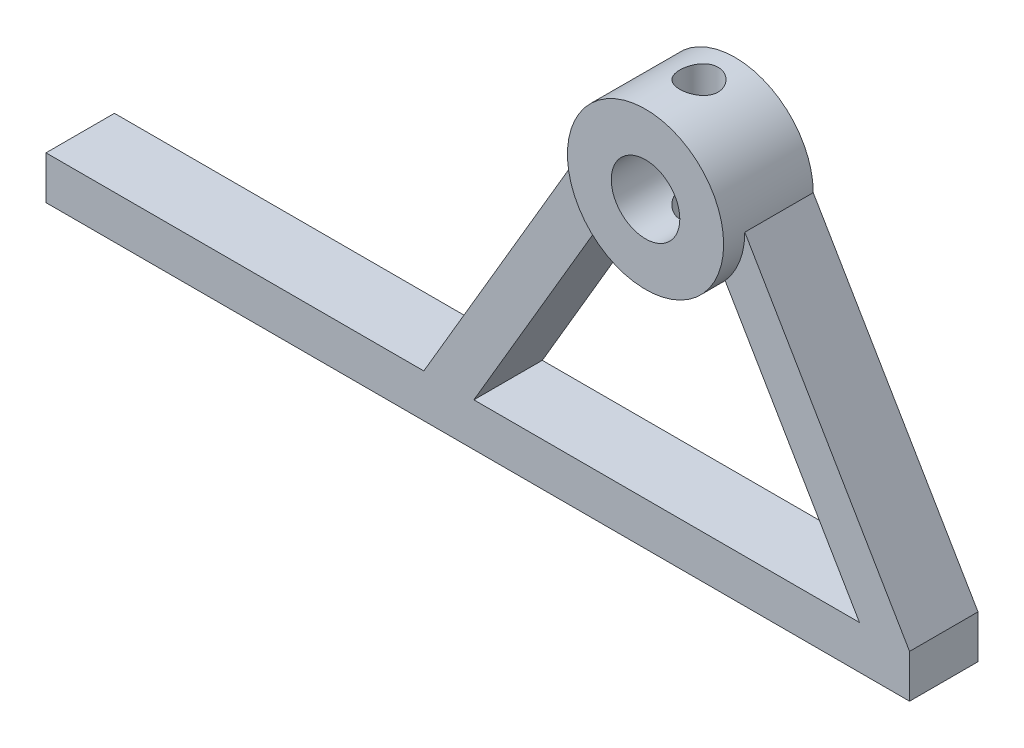
ISO-10303-21;
HEADER;
FILE_DESCRIPTION(('STEP AP214'),'2;1');
FILE_NAME('part.step','',(''),(''),'','','');
FILE_SCHEMA(('AUTOMOTIVE_DESIGN { 1 0 10303 214 1 1 1 1 }'));
ENDSEC;
DATA;
#1=APPLICATION_CONTEXT('core data for automotive mechanical design processes');
#2=APPLICATION_PROTOCOL_DEFINITION('international standard','automotive_design',2000,#1);
#3=PRODUCT_CONTEXT('',#1,'mechanical');
#4=PRODUCT('Part','Part','',(#3));
#5=PRODUCT_RELATED_PRODUCT_CATEGORY('part','',(#4));
#6=PRODUCT_DEFINITION_FORMATION('','',#4);
#7=PRODUCT_DEFINITION_CONTEXT('part definition',#1,'design');
#8=PRODUCT_DEFINITION('design','',#6,#7);
#9=PRODUCT_DEFINITION_SHAPE('','',#8);
#10=(LENGTH_UNIT() NAMED_UNIT(*) SI_UNIT(.MILLI.,.METRE.));
#11=(NAMED_UNIT(*) PLANE_ANGLE_UNIT() SI_UNIT($,.RADIAN.));
#12=(NAMED_UNIT(*) SI_UNIT($,.STERADIAN.) SOLID_ANGLE_UNIT());
#13=UNCERTAINTY_MEASURE_WITH_UNIT(LENGTH_MEASURE(1.E-05),#10,'distance_accuracy_value','');
#14=(GEOMETRIC_REPRESENTATION_CONTEXT(3) GLOBAL_UNCERTAINTY_ASSIGNED_CONTEXT((#13)) GLOBAL_UNIT_ASSIGNED_CONTEXT((#10,
#11,#12)) REPRESENTATION_CONTEXT('',''));
#15=CARTESIAN_POINT('',(0.,0.,0.));
#16=DIRECTION('',(0.,0.,1.));
#17=DIRECTION('',(1.,0.,0.));
#18=AXIS2_PLACEMENT_3D('',#15,#16,#17);
#19=CARTESIAN_POINT('',(0.,8.31996617059704,6.34));
#20=DIRECTION('',(0.,0.,-1.));
#21=DIRECTION('',(-1.,0.,0.));
#22=AXIS2_PLACEMENT_3D('',#19,#20,#21);
#23=CYLINDRICAL_SURFACE('',#22,7.23570529257752);
#24=DIRECTION('',(0.,0.,-1.));
#25=VECTOR('',#24,1.);
#26=CARTESIAN_POINT('',(5.41494743870985,3.52061461887218,6.34));
#27=LINE('',#26,#25);
#28=CARTESIAN_POINT('',(5.41494743870985,3.52061461887218,6.34));
#29=VERTEX_POINT('',#28);
#30=CARTESIAN_POINT('',(5.41494743870985,3.52061461887218,0.));
#31=VERTEX_POINT('',#30);
#32=EDGE_CURVE('E255',#29,#31,#27,.T.);
#33=ORIENTED_EDGE('',*,*,#32,.F.);
#34=CARTESIAN_POINT('',(0.,8.31996617059704,6.34));
#35=DIRECTION('',(0.,0.,1.));
#36=DIRECTION('',(1.,0.,0.));
#37=AXIS2_PLACEMENT_3D('',#34,#35,#36);
#38=CIRCLE('',#37,7.2357052925775);
#39=CARTESIAN_POINT('',(7.2357052925775,8.31996617059704,6.34));
#40=VERTEX_POINT('',#39);
#41=EDGE_CURVE('E110',#29,#40,#38,.T.);
#42=ORIENTED_EDGE('',*,*,#41,.T.);
#43=DIRECTION('',(0.,0.,-1.));
#44=VECTOR('',#43,1.);
#45=CARTESIAN_POINT('',(7.23570529378876,8.31996617059705,6.34));
#46=LINE('',#45,#44);
#47=CARTESIAN_POINT('',(7.23570529378876,8.31996617059705,0.));
#48=VERTEX_POINT('',#47);
#49=EDGE_CURVE('E317',#40,#48,#46,.T.);
#50=ORIENTED_EDGE('',*,*,#49,.T.);
#51=CARTESIAN_POINT('',(0.,8.31996617059704,0.));
#52=DIRECTION('',(0.,0.,1.));
#53=DIRECTION('',(1.,0.,0.));
#54=AXIS2_PLACEMENT_3D('',#51,#52,#53);
#55=CIRCLE('',#54,7.23570529257752);
#56=CARTESIAN_POINT('',(-7.23570529378876,8.31996617059705,0.));
#57=VERTEX_POINT('',#56);
#58=EDGE_CURVE('E342',#48,#57,#55,.T.);
#59=ORIENTED_EDGE('',*,*,#58,.T.);
#60=DIRECTION('',(0.,0.,-1.));
#61=VECTOR('',#60,1.);
#62=CARTESIAN_POINT('',(-7.23570529378876,8.31996617059705,6.34));
#63=LINE('',#62,#61);
#64=CARTESIAN_POINT('',(-7.23570529378876,8.31996617059705,6.34));
#65=VERTEX_POINT('',#64);
#66=EDGE_CURVE('E336',#65,#57,#63,.T.);
#67=ORIENTED_EDGE('',*,*,#66,.F.);
#68=CARTESIAN_POINT('',(-5.41494743870986,3.52061461887219,6.34));
#69=VERTEX_POINT('',#68);
#70=EDGE_CURVE('E12',#65,#69,#38,.T.);
#71=ORIENTED_EDGE('',*,*,#70,.T.);
#72=DIRECTION('',(0.,0.,-1.));
#73=VECTOR('',#72,1.);
#74=CARTESIAN_POINT('',(-5.41494743870986,3.52061461887219,6.34));
#75=LINE('',#74,#73);
#76=CARTESIAN_POINT('',(-5.41494743870986,3.52061461887219,0.));
#77=VERTEX_POINT('',#76);
#78=EDGE_CURVE('E118',#69,#77,#75,.T.);
#79=ORIENTED_EDGE('',*,*,#78,.T.);
#80=CARTESIAN_POINT('',(0.,8.31996617059704,0.));
#81=DIRECTION('',(0.,0.,1.));
#82=DIRECTION('',(1.,0.,0.));
#83=AXIS2_PLACEMENT_3D('',#80,#81,#82);
#84=CIRCLE('',#83,7.23570529257752);
#85=EDGE_CURVE('E310',#77,#31,#84,.T.);
#86=ORIENTED_EDGE('',*,*,#85,.T.);
#87=EDGE_LOOP('',(#33,#42,#50,#59,#67,#71,#79,#86));
#88=FACE_BOUND('',#87,.T.);
#89=CARTESIAN_POINT('',(0.,1.08426087801953,1.575));
#90=CARTESIAN_POINT('',(0.0981293637891472,1.08426257424642,1.57500285873572));
#91=CARTESIAN_POINT('',(0.196291043379197,1.08627704999838,1.58316489177198));
#92=CARTESIAN_POINT('',(0.389805021552214,1.0941181011956,1.61555085608534));
#93=CARTESIAN_POINT('',(0.485155627832811,1.09994692585659,1.63978426431996));
#94=CARTESIAN_POINT('',(0.670224664897337,1.11477066117578,1.70349167894221));
#95=CARTESIAN_POINT('',(0.759949578522831,1.12376184558826,1.74294775356416));
#96=CARTESIAN_POINT('',(0.931506357787034,1.1439507247905,1.83591834740036));
#97=CARTESIAN_POINT('',(1.01333802932335,1.1551484738212,1.88943321221332));
#98=CARTESIAN_POINT('',(1.16841309642244,1.17878203056062,2.01012663890712));
#99=CARTESIAN_POINT('',(1.24147715947267,1.19123636672997,2.07753200423267));
#100=CARTESIAN_POINT('',(1.37538491241145,1.21585517489402,2.22360724594247));
#101=CARTESIAN_POINT('',(1.43622727169011,1.22801961520004,2.30227834726244));
#102=CARTESIAN_POINT('',(1.54479965438126,1.2508674360303,2.47003381827228));
#103=CARTESIAN_POINT('',(1.59233060342196,1.26152725746472,2.55925052965843));
#104=CARTESIAN_POINT('',(1.67165124566989,1.2798893169628,2.7447113297322));
#105=CARTESIAN_POINT('',(1.70344335304699,1.28759200857782,2.84095433806067));
#106=CARTESIAN_POINT('',(1.74977506659072,1.29897750135838,3.03576783492458));
#107=CARTESIAN_POINT('',(1.76463636241809,1.30273514699916,3.13425734276719));
#108=CARTESIAN_POINT('',(1.77768634500219,1.30602923822816,3.33239776767815));
#109=CARTESIAN_POINT('',(1.77587763735072,1.30556634350474,3.43204850081031));
#110=CARTESIAN_POINT('',(1.75589596499611,1.30053901032399,3.62722911425537));
#111=CARTESIAN_POINT('',(1.73810477401277,1.29607026495622,3.72280092671));
#112=CARTESIAN_POINT('',(1.68727151511118,1.28368705526387,3.90956020406694));
#113=CARTESIAN_POINT('',(1.65422839677104,1.27577235361353,4.00074736651448));
#114=CARTESIAN_POINT('',(1.57349998989746,1.25730017504681,4.17718036486528));
#115=CARTESIAN_POINT('',(1.5256748570831,1.24671764359194,4.26235948064019));
#116=CARTESIAN_POINT('',(1.41683788108453,1.22411652198172,4.42362107990157));
#117=CARTESIAN_POINT('',(1.35582380961349,1.21209768931521,4.49970202286313));
#118=CARTESIAN_POINT('',(1.22035651032222,1.18757404433834,4.64279709908393));
#119=CARTESIAN_POINT('',(1.14558070775374,1.17506494199195,4.70950548812204));
#120=CARTESIAN_POINT('',(0.985754722337625,1.15126779568275,4.82949244855246));
#121=CARTESIAN_POINT('',(0.900704248275997,1.13997978634645,4.8827706391618));
#122=CARTESIAN_POINT('',(0.72231695182341,1.11984384441888,4.97449119211096));
#123=CARTESIAN_POINT('',(0.628954422977528,1.11100385547813,5.01288541452675));
#124=CARTESIAN_POINT('',(0.436835559073769,1.0968178970057,5.07335021161882));
#125=CARTESIAN_POINT('',(0.33808021995058,1.09147128467215,5.09542378948826));
#126=CARTESIAN_POINT('',(0.140594422288552,1.08496905176048,5.12215730197071));
#127=CARTESIAN_POINT('',(0.0419235708735869,1.08371319823331,5.12723379262381));
#128=CARTESIAN_POINT('',(-0.154857485097231,1.08524922883582,5.12096940495356));
#129=CARTESIAN_POINT('',(-0.252967737389407,1.08804076300456,5.10962994604985));
#130=CARTESIAN_POINT('',(-0.444405715736421,1.09729382439406,5.07119928462973));
#131=CARTESIAN_POINT('',(-0.537781559311008,1.10370269623694,5.04433395157955));
#132=CARTESIAN_POINT('',(-0.718697311918951,1.11946908048706,4.97587098888264));
#133=CARTESIAN_POINT('',(-0.806236643528252,1.12882688411829,4.93427190414286));
#134=CARTESIAN_POINT('',(-0.97466215300344,1.14969444840807,4.83670550660005));
#135=CARTESIAN_POINT('',(-1.05540778164661,1.1612384954572,4.78050307608622));
#136=CARTESIAN_POINT('',(-1.20646989685708,1.18514167363069,4.65562728785723));
#137=CARTESIAN_POINT('',(-1.27678465056378,1.19750093969418,4.58695186223383));
#138=CARTESIAN_POINT('',(-1.40669487545757,1.22200015777127,4.43714857986594));
#139=CARTESIAN_POINT('',(-1.46599867030701,1.23412807671991,4.35576539796969));
#140=CARTESIAN_POINT('',(-1.57010547339663,1.25646520012583,4.18395513209805));
#141=CARTESIAN_POINT('',(-1.61490912940746,1.26667449028625,4.09352845236286));
#142=CARTESIAN_POINT('',(-1.68841319806672,1.28390776437535,3.90668768071109));
#143=CARTESIAN_POINT('',(-1.71720896752772,1.29095056153057,3.81031292784252));
#144=CARTESIAN_POINT('',(-1.75813665528963,1.30107456311882,3.61389201822486));
#145=CARTESIAN_POINT('',(-1.77027205726437,1.30415659573695,3.51384663349636));
#146=CARTESIAN_POINT('',(-1.77735764791121,1.30594866389195,3.31588788439481));
#147=CARTESIAN_POINT('',(-1.77277337464751,1.3047771384697,3.21799198349369));
#148=CARTESIAN_POINT('',(-1.74761130419212,1.29846698684935,3.02441462383575));
#149=CARTESIAN_POINT('',(-1.72703380560927,1.29332843471947,2.92873312376829));
#150=CARTESIAN_POINT('',(-1.67071924830787,1.27972796930061,2.7427852558613));
#151=CARTESIAN_POINT('',(-1.63506643214471,1.27128454321148,2.65249193042336));
#152=CARTESIAN_POINT('',(-1.54968050617995,1.25202244806195,2.47910539817148));
#153=CARTESIAN_POINT('',(-1.4999455162089,1.241203461874,2.39601315474002));
#154=CARTESIAN_POINT('',(-1.38633426672655,1.21806898821038,2.2371305622628));
#155=CARTESIAN_POINT('',(-1.32213356945325,1.20572268707389,2.16157665365888));
#156=CARTESIAN_POINT('',(-1.18204964867792,1.18111207044895,2.02216294432385));
#157=CARTESIAN_POINT('',(-1.10616367001342,1.16884777500928,1.95830590928332));
#158=CARTESIAN_POINT('',(-0.943282705195668,1.14553062994439,1.84302673114473));
#159=CARTESIAN_POINT('',(-0.856118598034548,1.13450234091044,1.79183821458208));
#160=CARTESIAN_POINT('',(-0.674161211817387,1.11515661597234,1.70492221858693));
#161=CARTESIAN_POINT('',(-0.57937361155899,1.10683718511934,1.66918335481451));
#162=CARTESIAN_POINT('',(-0.40392492122402,1.09511738127397,1.61965717754671));
#163=CARTESIAN_POINT('',(-0.324119308628411,1.09107371059674,1.60294623468573));
#164=CARTESIAN_POINT('',(-0.162883143466196,1.0856448474834,1.58061684539134));
#165=CARTESIAN_POINT('',(-0.0814527043683004,1.08425947005904,1.57499762709401));
#166=CARTESIAN_POINT('',(0.,1.08426087801953,1.575));
#167=B_SPLINE_CURVE_WITH_KNOTS('',3,(#89,#90,#91,#92,#93,#94,#95,#96,#97,#98,#99,#100,#101,#102,
#103,#104,#105,#106,#107,#108,#109,#110,#111,#112,#113,#114,#115,#116,#117,#118,#119,#120,#121,
#122,#123,#124,#125,#126,#127,#128,#129,#130,#131,#132,#133,#134,#135,#136,#137,#138,#139,#140,
#141,#142,#143,#144,#145,#146,#147,#148,#149,#150,#151,#152,#153,#154,#155,#156,#157,#158,#159,
#160,#161,#162,#163,#164,#165,#166),.UNSPECIFIED.,.T.,.F.,(4,2,2,2,2,2,2,2,2,2,2,2,2,2,2,2,2,2,
2,2,2,2,2,2,2,2,2,2,2,2,2,2,2,2,2,2,2,2,4),(0.,0.294089653231276,0.588352879427399,
0.882270527043149,1.17619540053399,1.47536576999378,1.77456869330699,2.07803261374741,
2.38144997163627,2.67900079691094,2.97650511452646,3.26708654183482,3.55768798488513,
3.85112744839997,4.14461652766342,4.44615153352145,4.74769508776238,5.05020595969219,
5.35266115215222,5.64764744455298,5.94260823222543,6.23338226095027,6.52418501428698,
6.81999611343366,7.11585630019097,7.41868906501615,7.72150829940073,8.02250380337595,
8.32343635976304,8.61605460532459,8.90866738755456,9.19966618755848,9.49070385835505,
9.78906721144412,10.0875010208412,10.3910853249227,10.6944455448361,10.9385729272919,
11.1826833205264),.UNSPECIFIED.);
#168=CARTESIAN_POINT('',(0.,1.08426087801953,1.575));
#169=VERTEX_POINT('',#168);
#170=EDGE_CURVE('E225',#169,#169,#167,.T.);
#171=ORIENTED_EDGE('',*,*,#170,.F.);
#172=EDGE_LOOP('',(#171));
#173=FACE_BOUND('',#172,.T.);
#174=CARTESIAN_POINT('',(0.,8.31996617059704,8.3));
#175=DIRECTION('',(0.,0.,1.));
#176=DIRECTION('',(1.,0.,0.));
#177=AXIS2_PLACEMENT_3D('',#174,#175,#176);
#178=CIRCLE('',#177,7.2357052925775);
#179=CARTESIAN_POINT('',(7.2357052925775,8.31996617059704,8.3));
#180=VERTEX_POINT('',#179);
#181=EDGE_CURVE('E217',#180,#180,#178,.T.);
#182=ORIENTED_EDGE('',*,*,#181,.F.);
#183=EDGE_LOOP('',(#182));
#184=FACE_BOUND('',#183,.T.);
#185=CARTESIAN_POINT('',(0.,15.5556714631746,1.575));
#186=CARTESIAN_POINT('',(-0.0981293637891471,15.5556697669477,1.57500285873572));
#187=CARTESIAN_POINT('',(-0.196291043379197,15.5536552911957,1.58316489177198));
#188=CARTESIAN_POINT('',(-0.389805021552214,15.5458142399985,1.61555085608534));
#189=CARTESIAN_POINT('',(-0.485155627832811,15.5399854153375,1.63978426431996));
#190=CARTESIAN_POINT('',(-0.670224664897337,15.5251616800183,1.70349167894221));
#191=CARTESIAN_POINT('',(-0.759949578522831,15.5161704956058,1.74294775356416));
#192=CARTESIAN_POINT('',(-0.931506357787034,15.4959816164036,1.83591834740036));
#193=CARTESIAN_POINT('',(-1.01333802932335,15.4847838673729,1.88943321221332));
#194=CARTESIAN_POINT('',(-1.16841309642244,15.4611503106335,2.01012663890712));
#195=CARTESIAN_POINT('',(-1.24147715947267,15.4486959744641,2.07753200423267));
#196=CARTESIAN_POINT('',(-1.37538491241145,15.4240771663001,2.22360724594247));
#197=CARTESIAN_POINT('',(-1.43622727169011,15.411912725994,2.30227834726244));
#198=CARTESIAN_POINT('',(-1.54479965438126,15.3890649051638,2.47003381827228));
#199=CARTESIAN_POINT('',(-1.59233060342196,15.3784050837294,2.55925052965843));
#200=CARTESIAN_POINT('',(-1.67165124566988,15.3600430242313,2.7447113297322));
#201=CARTESIAN_POINT('',(-1.70344335304699,15.3523403326163,2.84095433806067));
#202=CARTESIAN_POINT('',(-1.74977506659072,15.3409548398357,3.03576783492458));
#203=CARTESIAN_POINT('',(-1.76463636241809,15.3371971941949,3.13425734276719));
#204=CARTESIAN_POINT('',(-1.77768634500219,15.3339031029659,3.33239776767815));
#205=CARTESIAN_POINT('',(-1.77587763735072,15.3343659976894,3.43204850081031));
#206=CARTESIAN_POINT('',(-1.75589596499611,15.3393933308701,3.62722911425537));
#207=CARTESIAN_POINT('',(-1.73810477401277,15.3438620762379,3.72280092671));
#208=CARTESIAN_POINT('',(-1.68727151511118,15.3562452859302,3.90956020406694));
#209=CARTESIAN_POINT('',(-1.65422839677104,15.3641599875806,4.00074736651448));
#210=CARTESIAN_POINT('',(-1.57349998989746,15.3826321661473,4.17718036486528));
#211=CARTESIAN_POINT('',(-1.5256748570831,15.3932146976022,4.26235948064019));
#212=CARTESIAN_POINT('',(-1.41683788108453,15.4158158192124,4.42362107990157));
#213=CARTESIAN_POINT('',(-1.35582380961349,15.4278346518789,4.49970202286313));
#214=CARTESIAN_POINT('',(-1.22035651032222,15.4523582968557,4.64279709908393));
#215=CARTESIAN_POINT('',(-1.14558070775374,15.4648673992021,4.70950548812204));
#216=CARTESIAN_POINT('',(-0.985754722337625,15.4886645455113,4.82949244855246));
#217=CARTESIAN_POINT('',(-0.900704248275997,15.4999525548476,4.8827706391618));
#218=CARTESIAN_POINT('',(-0.72231695182341,15.5200884967752,4.97449119211096));
#219=CARTESIAN_POINT('',(-0.628954422977528,15.528928485716,5.01288541452675));
#220=CARTESIAN_POINT('',(-0.436835559073768,15.5431144441884,5.07335021161882));
#221=CARTESIAN_POINT('',(-0.33808021995058,15.5484610565219,5.09542378948826));
#222=CARTESIAN_POINT('',(-0.140594422288551,15.5549632894336,5.12215730197071));
#223=CARTESIAN_POINT('',(-0.0419235708735863,15.5562191429608,5.12723379262381));
#224=CARTESIAN_POINT('',(0.154857485097232,15.5546831123583,5.12096940495356));
#225=CARTESIAN_POINT('',(0.252967737389408,15.5518915781895,5.10962994604985));
#226=CARTESIAN_POINT('',(0.444405715736422,15.5426385168,5.07119928462973));
#227=CARTESIAN_POINT('',(0.537781559311009,15.5362296449572,5.04433395157955));
#228=CARTESIAN_POINT('',(0.718697311918952,15.520463260707,4.97587098888264));
#229=CARTESIAN_POINT('',(0.806236643528253,15.5111054570758,4.93427190414286));
#230=CARTESIAN_POINT('',(0.974662153003441,15.490237892786,4.83670550660005));
#231=CARTESIAN_POINT('',(1.05540778164661,15.4786938457369,4.78050307608622));
#232=CARTESIAN_POINT('',(1.20646989685708,15.4547906675634,4.65562728785723));
#233=CARTESIAN_POINT('',(1.27678465056378,15.4424314014999,4.58695186223383));
#234=CARTESIAN_POINT('',(1.40669487545757,15.4179321834228,4.43714857986594));
#235=CARTESIAN_POINT('',(1.46599867030702,15.4058042644742,4.35576539796969));
#236=CARTESIAN_POINT('',(1.57010547339663,15.3834671410683,4.18395513209805));
#237=CARTESIAN_POINT('',(1.61490912940746,15.3732578509078,4.09352845236286));
#238=CARTESIAN_POINT('',(1.68841319806672,15.3560245768187,3.90668768071109));
#239=CARTESIAN_POINT('',(1.71720896752772,15.3489817796635,3.81031292784252));
#240=CARTESIAN_POINT('',(1.75813665528963,15.3388577780753,3.61389201822486));
#241=CARTESIAN_POINT('',(1.77027205726437,15.3357757454571,3.51384663349636));
#242=CARTESIAN_POINT('',(1.77735764791121,15.3339836773021,3.31588788439481));
#243=CARTESIAN_POINT('',(1.77277337464751,15.3351552027244,3.21799198349369));
#244=CARTESIAN_POINT('',(1.74761130419212,15.3414653543447,3.02441462383575));
#245=CARTESIAN_POINT('',(1.72703380560927,15.3466039064746,2.92873312376829));
#246=CARTESIAN_POINT('',(1.67071924830787,15.3602043718935,2.7427852558613));
#247=CARTESIAN_POINT('',(1.63506643214471,15.3686477979826,2.65249193042336));
#248=CARTESIAN_POINT('',(1.54968050617995,15.3879098931321,2.47910539817148));
#249=CARTESIAN_POINT('',(1.4999455162089,15.3987288793201,2.39601315474002));
#250=CARTESIAN_POINT('',(1.38633426672655,15.4218633529837,2.2371305622628));
#251=CARTESIAN_POINT('',(1.32213356945325,15.4342096541202,2.16157665365887));
#252=CARTESIAN_POINT('',(1.18204964867792,15.4588202707451,2.02216294432385));
#253=CARTESIAN_POINT('',(1.10616367001342,15.4710845661848,1.95830590928332));
#254=CARTESIAN_POINT('',(0.943282705195667,15.4944017112497,1.84302673114473));
#255=CARTESIAN_POINT('',(0.856118598034547,15.5054300002837,1.79183821458208));
#256=CARTESIAN_POINT('',(0.674161211817387,15.5247757252218,1.70492221858693));
#257=CARTESIAN_POINT('',(0.57937361155899,15.5330951560747,1.66918335481451));
#258=CARTESIAN_POINT('',(0.403924921224019,15.5448149599201,1.61965717754671));
#259=CARTESIAN_POINT('',(0.32411930862841,15.5488586305973,1.60294623468573));
#260=CARTESIAN_POINT('',(0.162883143466195,15.5542874937107,1.58061684539134));
#261=CARTESIAN_POINT('',(0.0814527043683001,15.5556728711351,1.57499762709401));
#262=CARTESIAN_POINT('',(0.,15.5556714631746,1.575));
#263=B_SPLINE_CURVE_WITH_KNOTS('',3,(#185,#186,#187,#188,#189,#190,#191,#192,#193,#194,#195,
#196,#197,#198,#199,#200,#201,#202,#203,#204,#205,#206,#207,#208,#209,#210,#211,#212,#213,#214,
#215,#216,#217,#218,#219,#220,#221,#222,#223,#224,#225,#226,#227,#228,#229,#230,#231,#232,#233,
#234,#235,#236,#237,#238,#239,#240,#241,#242,#243,#244,#245,#246,#247,#248,#249,#250,#251,#252,
#253,#254,#255,#256,#257,#258,#259,#260,#261,#262),.UNSPECIFIED.,.T.,.F.,(4,2,2,2,2,2,2,2,2,2,2,
2,2,2,2,2,2,2,2,2,2,2,2,2,2,2,2,2,2,2,2,2,2,2,2,2,2,2,4),(0.,0.294089653231276,
0.588352879427399,0.88227052704315,1.17619540053399,1.47536576999378,1.77456869330699,
2.07803261374741,2.38144997163627,2.67900079691094,2.97650511452646,3.26708654183482,
3.55768798488513,3.85112744839997,4.14461652766342,4.44615153352145,4.74769508776237,
5.05020595969219,5.35266115215222,5.64764744455298,5.94260823222543,6.23338226095027,
6.52418501428698,6.81999611343366,7.11585630019097,7.41868906501615,7.72150829940073,
8.02250380337594,8.32343635976304,8.61605460532459,8.90866738755456,9.19966618755848,
9.49070385835505,9.78906721144412,10.0875010208412,10.3910853249227,10.6944455448361,
10.9385729272919,11.1826833205264),.UNSPECIFIED.);
#264=CARTESIAN_POINT('',(0.,15.5556714631746,1.575));
#265=VERTEX_POINT('',#264);
#266=EDGE_CURVE('E231',#265,#265,#263,.T.);
#267=ORIENTED_EDGE('',*,*,#266,.F.);
#268=EDGE_LOOP('',(#267));
#269=FACE_BOUND('',#268,.T.);
#270=ADVANCED_FACE('F97',(#88,#173,#184,#269),#23,.T.);
#271=CARTESIAN_POINT('',(0.,8.31996617059704,6.34));
#272=DIRECTION('',(0.,0.,-1.));
#273=DIRECTION('',(-1.,0.,0.));
#274=AXIS2_PLACEMENT_3D('',#271,#272,#273);
#275=CYLINDRICAL_SURFACE('',#274,3.175);
#276=CARTESIAN_POINT('',(0.,5.14496617059705,1.575));
#277=CARTESIAN_POINT('',(0.0920457733672527,5.14496318642392,1.57499656251647));
#278=CARTESIAN_POINT('',(0.184071713050879,5.1490025914375,1.58219068684379));
#279=CARTESIAN_POINT('',(0.365258198324651,5.16473526573789,1.61056870992208));
#280=CARTESIAN_POINT('',(0.454418344940306,5.17642959593962,1.63175454782269));
#281=CARTESIAN_POINT('',(0.627089614342208,5.20627967485704,1.68699707583655));
#282=CARTESIAN_POINT('',(0.710620218986029,5.22441161710105,1.7210063727897));
#283=CARTESIAN_POINT('',(0.870631332083555,5.26554970485655,1.80060668787446));
#284=CARTESIAN_POINT('',(0.947110114120685,5.28855703943124,1.84620053191111));
#285=CARTESIAN_POINT('',(1.09685408536145,5.33932581410492,1.9512576336454));
#286=CARTESIAN_POINT('',(1.1695183374774,5.36730744191472,2.0114690063896));
#287=CARTESIAN_POINT('',(1.30429436434383,5.42431311285338,2.14240634304093));
#288=CARTESIAN_POINT('',(1.36639518682575,5.45333820054811,2.21314307904764));
#289=CARTESIAN_POINT('',(1.4847389501691,5.51265589070275,2.37176157412858));
#290=CARTESIAN_POINT('',(1.53972067399091,5.54277136564433,2.46065869016844));
#291=CARTESIAN_POINT('',(1.63371522739607,5.59699693064802,2.64817674184863));
#292=CARTESIAN_POINT('',(1.67275118710772,5.62111569920135,2.74678333369241));
#293=CARTESIAN_POINT('',(1.72649393264176,5.65526479513943,2.92942772309589));
#294=CARTESIAN_POINT('',(1.74460859012406,5.66720012037705,3.01210642382977));
#295=CARTESIAN_POINT('',(1.76885928976954,5.68330470580095,3.17991376496099));
#296=CARTESIAN_POINT('',(1.77500735520024,5.68748176080842,3.26503985899207));
#297=CARTESIAN_POINT('',(1.77499262125772,5.6874719321377,3.43538519366942));
#298=CARTESIAN_POINT('',(1.76881564836777,5.6832754190445,3.52060442878929));
#299=CARTESIAN_POINT('',(1.74447912646818,5.6671144264559,3.68857121602932));
#300=CARTESIAN_POINT('',(1.72631168965979,5.65514483360621,3.77131710360387));
#301=CARTESIAN_POINT('',(1.67888002635925,5.62501424840583,3.93226117964787));
#302=CARTESIAN_POINT('',(1.64962273735578,5.60685712750803,4.01046217606764));
#303=CARTESIAN_POINT('',(1.58101248802604,5.56631236506559,4.16110027487085));
#304=CARTESIAN_POINT('',(1.54165559959801,5.54392307837209,4.23353512019385));
#305=CARTESIAN_POINT('',(1.44695859164234,5.49326509467039,4.38240951688615));
#306=CARTESIAN_POINT('',(1.39009122677056,5.46462174768092,4.45775163556914));
#307=CARTESIAN_POINT('',(1.26518919572122,5.40712319242101,4.59851360641819));
#308=CARTESIAN_POINT('',(1.19714555925232,5.37826783190255,4.66392540649819));
#309=CARTESIAN_POINT('',(1.04330846329617,5.32003763806771,4.78979220822513));
#310=CARTESIAN_POINT('',(0.956404831064511,5.29092110974693,4.84902342814026));
#311=CARTESIAN_POINT('',(0.772080344886383,5.23878709264507,4.95175696135675));
#312=CARTESIAN_POINT('',(0.674666417041731,5.21576562146328,4.99526955173587));
#313=CARTESIAN_POINT('',(0.479212151960511,5.17987993219457,5.06197960575857));
#314=CARTESIAN_POINT('',(0.381701583664295,5.16641336013076,5.08639443331067));
#315=CARTESIAN_POINT('',(0.183165970100793,5.1486929198411,5.11837726944116));
#316=CARTESIAN_POINT('',(0.0821441897126967,5.14443071416002,5.12596052448752));
#317=CARTESIAN_POINT('',(-0.107986376066928,5.14554408780453,5.12396383587927));
#318=CARTESIAN_POINT('',(-0.197128235840454,5.14986699650364,5.11625860580406));
#319=CARTESIAN_POINT('',(-0.372617770226194,5.16567687710039,5.08772334173619));
#320=CARTESIAN_POINT('',(-0.458965362695635,5.17716405940454,5.06689292227159));
#321=CARTESIAN_POINT('',(-0.626212044683011,5.20618054783522,5.01317957904674));
#322=CARTESIAN_POINT('',(-0.707136424118293,5.22367907915433,4.98035799018906));
#323=CARTESIAN_POINT('',(-0.862412451560793,5.26328517078707,4.90382421732422));
#324=CARTESIAN_POINT('',(-0.936762373090722,5.28539393667706,4.86010918409699));
#325=CARTESIAN_POINT('',(-1.0850443106616,5.33499884521285,4.75791693821676));
#326=CARTESIAN_POINT('',(-1.15813842486154,5.3628156537343,4.69838078008982));
#327=CARTESIAN_POINT('',(-1.29386310001727,5.41962673372876,4.56875547389148));
#328=CARTESIAN_POINT('',(-1.35648187365394,5.44862228659554,4.49865460424378));
#329=CARTESIAN_POINT('',(-1.47602180672726,5.50804824602859,4.3413260131801));
#330=CARTESIAN_POINT('',(-1.53168974119548,5.53831832873433,4.25307763129444));
#331=CARTESIAN_POINT('',(-1.62719453187299,5.59307971589415,4.06678354894014));
#332=CARTESIAN_POINT('',(-1.66705354294033,5.61757908779927,3.96875180206105));
#333=CARTESIAN_POINT('',(-1.722492083879,5.65266633537753,3.78669881592416));
#334=CARTESIAN_POINT('',(-1.74140998591289,5.6650939837627,3.70404945804788));
#335=CARTESIAN_POINT('',(-1.76724961221682,5.68222012037642,3.53614296819974));
#336=CARTESIAN_POINT('',(-1.77418368339937,5.68692656349038,3.45088861245489));
#337=CARTESIAN_POINT('',(-1.77568104510472,5.68793593859204,3.28010213960793));
#338=CARTESIAN_POINT('',(-1.77022698011997,5.68422708093523,3.19456980066681));
#339=CARTESIAN_POINT('',(-1.74723057831317,5.6689300320314,3.0258550372683));
#340=CARTESIAN_POINT('',(-1.72968051419361,5.65733680406817,2.9426741503729));
#341=CARTESIAN_POINT('',(-1.68349033374719,5.62789994231684,2.78122907026488));
#342=CARTESIAN_POINT('',(-1.65491720905149,5.61009412627227,2.70293843400817));
#343=CARTESIAN_POINT('',(-1.58767169984076,5.57015716469806,2.55202967215085));
#344=CARTESIAN_POINT('',(-1.54899545668289,5.54802436739642,2.47941372765828));
#345=CARTESIAN_POINT('',(-1.45585854838626,5.49785700921811,2.33021436173964));
#346=CARTESIAN_POINT('',(-1.3998938032445,5.46943641744368,2.25469855221927));
#347=CARTESIAN_POINT('',(-1.27683894572217,5.41223213970514,2.11343485558195));
#348=CARTESIAN_POINT('',(-1.20973979436034,5.38344817643914,2.0476949875311));
#349=CARTESIAN_POINT('',(-1.05759640528217,5.32506319395989,1.92067751013193));
#350=CARTESIAN_POINT('',(-0.971395179550039,5.2957121424577,1.86065715568897));
#351=CARTESIAN_POINT('',(-0.788363918107655,5.24292952009685,1.75620354429279));
#352=CARTESIAN_POINT('',(-0.691540580362533,5.21949424936501,1.71176053809524));
#353=CARTESIAN_POINT('',(-0.497010099274286,5.18265806289372,1.64310803007092));
#354=CARTESIAN_POINT('',(-0.399842393373362,5.16866811127556,1.61769691637359));
#355=CARTESIAN_POINT('',(-0.201772974185958,5.14982776325129,1.58365205972387));
#356=CARTESIAN_POINT('',(-0.100874576616561,5.14496944100468,1.57500376719846));
#357=CARTESIAN_POINT('',(0.,5.14496617059705,1.575));
#358=B_SPLINE_CURVE_WITH_KNOTS('',3,(#276,#277,#278,#279,#280,#281,#282,#283,#284,#285,#286,
#287,#288,#289,#290,#291,#292,#293,#294,#295,#296,#297,#298,#299,#300,#301,#302,#303,#304,#305,
#306,#307,#308,#309,#310,#311,#312,#313,#314,#315,#316,#317,#318,#319,#320,#321,#322,#323,#324,
#325,#326,#327,#328,#329,#330,#331,#332,#333,#334,#335,#336,#337,#338,#339,#340,#341,#342,#343,
#344,#345,#346,#347,#348,#349,#350,#351,#352,#353,#354,#355,#356,#357),.UNSPECIFIED.,.T.,.F.,(4,
2,2,2,2,2,2,2,2,2,2,2,2,2,2,2,2,2,2,2,2,2,2,2,2,2,2,2,2,2,2,2,2,2,2,2,2,2,2,2,4),(0.,
0.275746443293082,0.551531111057641,0.826306363662632,1.10114870870601,1.39525447919038,
1.68966334700369,2.01438097587758,2.33862589853725,2.59394195903429,2.84900136156843,
3.1043542457236,3.35987527870464,3.61523672827081,3.87069764812881,4.16544776937977,
4.46043562927168,4.78611463080493,5.11158031143535,5.41406815231206,5.71628187996673,
5.98371683613603,6.25115964693316,6.5172532121948,6.78341644838272,7.07709715027945,
7.37110612376398,7.69543038935523,8.01929852243187,8.27526312438519,8.53096384904926,
8.7870230257512,9.04324593275914,9.29793559460069,9.55272267160817,9.84613802587954,
10.1397927524613,10.465296371667,10.7905959057703,11.0930539081578,11.3952492692606),.UNSPECIFIED.);
#359=CARTESIAN_POINT('',(0.,5.14496617059705,1.575));
#360=VERTEX_POINT('',#359);
#361=EDGE_CURVE('E223',#360,#360,#358,.T.);
#362=ORIENTED_EDGE('',*,*,#361,.T.);
#363=EDGE_LOOP('',(#362));
#364=FACE_BOUND('',#363,.T.);
#365=CARTESIAN_POINT('',(0.,8.31996617059704,0.));
#366=DIRECTION('',(0.,0.,1.));
#367=DIRECTION('',(1.,0.,0.));
#368=AXIS2_PLACEMENT_3D('',#365,#366,#367);
#369=CIRCLE('',#368,3.175);
#370=CARTESIAN_POINT('',(3.175,8.31996617059704,0.));
#371=VERTEX_POINT('',#370);
#372=EDGE_CURVE('E308',#371,#371,#369,.T.);
#373=ORIENTED_EDGE('',*,*,#372,.F.);
#374=EDGE_LOOP('',(#373));
#375=FACE_BOUND('',#374,.T.);
#376=CARTESIAN_POINT('',(0.,11.494966170597,1.575));
#377=CARTESIAN_POINT('',(-0.0920457733672527,11.4949691547702,1.57499656251647));
#378=CARTESIAN_POINT('',(-0.184071713050878,11.4909297497566,1.58219068684379));
#379=CARTESIAN_POINT('',(-0.36525819832465,11.4751970754562,1.61056870992208));
#380=CARTESIAN_POINT('',(-0.454418344940306,11.4635027452545,1.63175454782269));
#381=CARTESIAN_POINT('',(-0.627089614342208,11.4336526663371,1.68699707583655));
#382=CARTESIAN_POINT('',(-0.710620218986028,11.415520724093,1.7210063727897));
#383=CARTESIAN_POINT('',(-0.870631332083555,11.3743826363375,1.80060668787446));
#384=CARTESIAN_POINT('',(-0.947110114120684,11.3513753017628,1.84620053191111));
#385=CARTESIAN_POINT('',(-1.09685408536145,11.3006065270892,1.9512576336454));
#386=CARTESIAN_POINT('',(-1.1695183374774,11.2726248992794,2.0114690063896));
#387=CARTESIAN_POINT('',(-1.30429436434383,11.2156192283407,2.14240634304093));
#388=CARTESIAN_POINT('',(-1.36639518682575,11.186594140646,2.21314307904765));
#389=CARTESIAN_POINT('',(-1.4847389501691,11.1272764504913,2.37176157412858));
#390=CARTESIAN_POINT('',(-1.53972067399091,11.0971609755498,2.46065869016844));
#391=CARTESIAN_POINT('',(-1.63371522739607,11.0429354105461,2.64817674184863));
#392=CARTESIAN_POINT('',(-1.67275118710772,11.0188166419927,2.74678333369241));
#393=CARTESIAN_POINT('',(-1.72649393264177,10.9846675460547,2.92942772309589));
#394=CARTESIAN_POINT('',(-1.74460859012406,10.972732220817,3.01210642382977));
#395=CARTESIAN_POINT('',(-1.76885928976954,10.9566276353931,3.17991376496099));
#396=CARTESIAN_POINT('',(-1.77500735520024,10.9524505803857,3.26503985899207));
#397=CARTESIAN_POINT('',(-1.77499262125772,10.9524604090564,3.43538519366942));
#398=CARTESIAN_POINT('',(-1.76881564836777,10.9566569221496,3.52060442878929));
#399=CARTESIAN_POINT('',(-1.74447912646818,10.9728179147382,3.68857121602932));
#400=CARTESIAN_POINT('',(-1.72631168965979,10.9847875075879,3.77131710360387));
#401=CARTESIAN_POINT('',(-1.67888002635925,11.0149180927883,3.93226117964787));
#402=CARTESIAN_POINT('',(-1.64962273735578,11.0330752136861,4.01046217606764));
#403=CARTESIAN_POINT('',(-1.58101248802604,11.0736199761285,4.16110027487085));
#404=CARTESIAN_POINT('',(-1.54165559959801,11.096009262822,4.23353512019385));
#405=CARTESIAN_POINT('',(-1.44695859164234,11.1466672465237,4.38240951688615));
#406=CARTESIAN_POINT('',(-1.39009122677056,11.1753105935132,4.45775163556914));
#407=CARTESIAN_POINT('',(-1.26518919572122,11.2328091487731,4.5985136064182));
#408=CARTESIAN_POINT('',(-1.19714555925232,11.2616645092915,4.66392540649819));
#409=CARTESIAN_POINT('',(-1.04330846329617,11.3198947031264,4.78979220822513));
#410=CARTESIAN_POINT('',(-0.956404831064508,11.3490112314472,4.84902342814026));
#411=CARTESIAN_POINT('',(-0.77208034488638,11.401145248549,4.95175696135675));
#412=CARTESIAN_POINT('',(-0.674666417041729,11.4241667197308,4.99526955173587));
#413=CARTESIAN_POINT('',(-0.47921215196051,11.4600524089995,5.06197960575857));
#414=CARTESIAN_POINT('',(-0.381701583664294,11.4735189810633,5.08639443331067));
#415=CARTESIAN_POINT('',(-0.183165970100791,11.491239421353,5.11837726944116));
#416=CARTESIAN_POINT('',(-0.0821441897126953,11.4955016270341,5.12596052448752));
#417=CARTESIAN_POINT('',(0.107986376066929,11.4943882533896,5.12396383587927));
#418=CARTESIAN_POINT('',(0.197128235840456,11.4900653446905,5.11625860580406));
#419=CARTESIAN_POINT('',(0.372617770226195,11.4742554640937,5.08772334173619));
#420=CARTESIAN_POINT('',(0.458965362695636,11.4627682817896,5.06689292227159));
#421=CARTESIAN_POINT('',(0.626212044683011,11.4337517933589,5.01317957904674));
#422=CARTESIAN_POINT('',(0.707136424118293,11.4162532620398,4.98035799018906));
#423=CARTESIAN_POINT('',(0.862412451560793,11.376647170407,4.90382421732422));
#424=CARTESIAN_POINT('',(0.936762373090723,11.354538404517,4.86010918409699));
#425=CARTESIAN_POINT('',(1.0850443106616,11.3049334959812,4.75791693821676));
#426=CARTESIAN_POINT('',(1.15813842486154,11.2771166874598,4.69838078008982));
#427=CARTESIAN_POINT('',(1.29386310001727,11.2203056074653,4.56875547389148));
#428=CARTESIAN_POINT('',(1.35648187365394,11.1913100545986,4.49865460424378));
#429=CARTESIAN_POINT('',(1.47602180672726,11.1318840951655,4.3413260131801));
#430=CARTESIAN_POINT('',(1.53168974119548,11.1016140124598,4.25307763129443));
#431=CARTESIAN_POINT('',(1.62719453187299,11.0468526252999,4.06678354894014));
#432=CARTESIAN_POINT('',(1.66705354294033,11.0223532533948,3.96875180206105));
#433=CARTESIAN_POINT('',(1.722492083879,10.9872660058166,3.78669881592416));
#434=CARTESIAN_POINT('',(1.74140998591289,10.9748383574314,3.70404945804788));
#435=CARTESIAN_POINT('',(1.76724961221682,10.9577122208177,3.53614296819974));
#436=CARTESIAN_POINT('',(1.77418368339937,10.9530057777037,3.45088861245489));
#437=CARTESIAN_POINT('',(1.77568104510472,10.9519964026021,3.28010213960793));
#438=CARTESIAN_POINT('',(1.77022698011997,10.9557052602589,3.19456980066681));
#439=CARTESIAN_POINT('',(1.74723057831317,10.9710023091627,3.0258550372683));
#440=CARTESIAN_POINT('',(1.72968051419361,10.9825955371259,2.9426741503729));
#441=CARTESIAN_POINT('',(1.68349033374719,11.0120323988773,2.78122907026488));
#442=CARTESIAN_POINT('',(1.65491720905149,11.0298382149218,2.70293843400817));
#443=CARTESIAN_POINT('',(1.58767169984076,11.069775176496,2.55202967215085));
#444=CARTESIAN_POINT('',(1.54899545668289,11.0919079737977,2.47941372765828));
#445=CARTESIAN_POINT('',(1.45585854838626,11.142075331976,2.33021436173963));
#446=CARTESIAN_POINT('',(1.3998938032445,11.1704959237504,2.25469855221927));
#447=CARTESIAN_POINT('',(1.27683894572217,11.227700201489,2.11343485558195));
#448=CARTESIAN_POINT('',(1.20973979436034,11.2564841647549,2.0476949875311));
#449=CARTESIAN_POINT('',(1.05759640528217,11.3148691472342,1.92067751013193));
#450=CARTESIAN_POINT('',(0.971395179550037,11.3442201987364,1.86065715568897));
#451=CARTESIAN_POINT('',(0.788363918107654,11.3970028210972,1.75620354429279));
#452=CARTESIAN_POINT('',(0.691540580362532,11.4204380918291,1.71176053809523));
#453=CARTESIAN_POINT('',(0.497010099274285,11.4572742783004,1.64310803007092));
#454=CARTESIAN_POINT('',(0.399842393373361,11.4712642299185,1.61769691637359));
#455=CARTESIAN_POINT('',(0.201772974185958,11.4901045779428,1.58365205972387));
#456=CARTESIAN_POINT('',(0.100874576616561,11.4949629001894,1.57500376719846));
#457=CARTESIAN_POINT('',(0.,11.494966170597,1.575));
#458=B_SPLINE_CURVE_WITH_KNOTS('',3,(#376,#377,#378,#379,#380,#381,#382,#383,#384,#385,#386,
#387,#388,#389,#390,#391,#392,#393,#394,#395,#396,#397,#398,#399,#400,#401,#402,#403,#404,#405,
#406,#407,#408,#409,#410,#411,#412,#413,#414,#415,#416,#417,#418,#419,#420,#421,#422,#423,#424,
#425,#426,#427,#428,#429,#430,#431,#432,#433,#434,#435,#436,#437,#438,#439,#440,#441,#442,#443,
#444,#445,#446,#447,#448,#449,#450,#451,#452,#453,#454,#455,#456,#457),.UNSPECIFIED.,.T.,.F.,(4,
2,2,2,2,2,2,2,2,2,2,2,2,2,2,2,2,2,2,2,2,2,2,2,2,2,2,2,2,2,2,2,2,2,2,2,2,2,2,2,4),(0.,
0.275746443293082,0.551531111057641,0.826306363662631,1.10114870870601,1.39525447919038,
1.68966334700369,2.01438097587758,2.33862589853725,2.59394195903429,2.84900136156843,
3.1043542457236,3.35987527870464,3.61523672827082,3.87069764812881,4.16544776937977,
4.46043562927168,4.78611463080493,5.11158031143535,5.41406815231206,5.71628187996673,
5.98371683613603,6.25115964693316,6.5172532121948,6.78341644838272,7.07709715027945,
7.37110612376399,7.69543038935523,8.01929852243188,8.27526312438519,8.53096384904926,
8.78702302575121,9.04324593275914,9.29793559460069,9.55272267160817,9.84613802587954,
10.1397927524613,10.465296371667,10.7905959057703,11.0930539081578,11.3952492692606),.UNSPECIFIED.);
#459=CARTESIAN_POINT('',(0.,11.494966170597,1.575));
#460=VERTEX_POINT('',#459);
#461=EDGE_CURVE('E101',#460,#460,#458,.T.);
#462=ORIENTED_EDGE('',*,*,#461,.T.);
#463=EDGE_LOOP('',(#462));
#464=FACE_BOUND('',#463,.T.);
#465=CARTESIAN_POINT('',(0.,8.31996617059704,8.3));
#466=DIRECTION('',(0.,0.,1.));
#467=DIRECTION('',(1.,0.,0.));
#468=AXIS2_PLACEMENT_3D('',#465,#466,#467);
#469=CIRCLE('',#468,3.175);
#470=CARTESIAN_POINT('',(3.175,8.31996617059704,8.3));
#471=VERTEX_POINT('',#470);
#472=EDGE_CURVE('E213',#471,#471,#469,.T.);
#473=ORIENTED_EDGE('',*,*,#472,.T.);
#474=EDGE_LOOP('',(#473));
#475=FACE_BOUND('',#474,.T.);
#476=ADVANCED_FACE('F257',(#364,#375,#464,#475),#275,.F.);
#477=CARTESIAN_POINT('',(0.,0.,0.));
#478=DIRECTION('',(0.,0.,1.));
#479=DIRECTION('',(1.,0.,0.));
#480=AXIS2_PLACEMENT_3D('',#477,#478,#479);
#481=PLANE('',#480);
#482=DIRECTION('',(0.506285061150479,0.862366184898188,0.));
#483=VECTOR('',#482,1.);
#484=CARTESIAN_POINT('',(-9.01353945676856,5.29174317704849,0.));
#485=LINE('',#484,#483);
#486=CARTESIAN_POINT('',(-22.5,-17.680033829403,0.));
#487=VERTEX_POINT('',#486);
#488=EDGE_CURVE('E346',#487,#57,#485,.T.);
#489=ORIENTED_EDGE('',*,*,#488,.T.);
#490=ORIENTED_EDGE('',*,*,#58,.F.);
#491=DIRECTION('',(-0.506285061150479,0.862366184898188,0.));
#492=VECTOR('',#491,1.);
#493=CARTESIAN_POINT('',(9.01353945676856,5.29174317704849,0.));
#494=LINE('',#493,#492);
#495=CARTESIAN_POINT('',(22.5,-17.680033829403,0.));
#496=VERTEX_POINT('',#495);
#497=EDGE_CURVE('E314',#496,#48,#494,.T.);
#498=ORIENTED_EDGE('',*,*,#497,.F.);
#499=DIRECTION('',(0.,1.,0.));
#500=VECTOR('',#499,1.);
#501=CARTESIAN_POINT('',(22.5,0.,0.));
#502=LINE('',#501,#500);
#503=CARTESIAN_POINT('',(22.5,-21.680033829403,0.));
#504=VERTEX_POINT('',#503);
#505=EDGE_CURVE('E355',#504,#496,#502,.T.);
#506=ORIENTED_EDGE('',*,*,#505,.F.);
#507=DIRECTION('',(1.,0.,0.));
#508=VECTOR('',#507,1.);
#509=CARTESIAN_POINT('',(0.,-21.680033829403,0.));
#510=LINE('',#509,#508);
#511=CARTESIAN_POINT('',(-57.5,-21.680033829403,0.));
#512=VERTEX_POINT('',#511);
#513=EDGE_CURVE('E196',#512,#504,#510,.T.);
#514=ORIENTED_EDGE('',*,*,#513,.F.);
#515=DIRECTION('',(0.,-1.,0.));
#516=VECTOR('',#515,1.);
#517=CARTESIAN_POINT('',(-57.5,-17.680033829403,0.));
#518=LINE('',#517,#516);
#519=CARTESIAN_POINT('',(-57.5,-17.680033829403,0.));
#520=VERTEX_POINT('',#519);
#521=EDGE_CURVE('E187',#520,#512,#518,.T.);
#522=ORIENTED_EDGE('',*,*,#521,.F.);
#523=DIRECTION('',(1.,0.,0.));
#524=VECTOR('',#523,1.);
#525=CARTESIAN_POINT('',(-57.5,-17.680033829403,0.));
#526=LINE('',#525,#524);
#527=EDGE_CURVE('E193',#520,#487,#526,.T.);
#528=ORIENTED_EDGE('',*,*,#527,.T.);
#529=EDGE_LOOP('',(#489,#490,#498,#506,#514,#522,#528));
#530=FACE_BOUND('',#529,.T.);
#531=ORIENTED_EDGE('',*,*,#85,.F.);
#532=DIRECTION('',(0.506285061150479,0.862366184898188,0.));
#533=VECTOR('',#532,1.);
#534=CARTESIAN_POINT('',(-5.5640747171758,3.26660293244658,0.));
#535=LINE('',#534,#533);
#536=CARTESIAN_POINT('',(-17.8615992022319,-17.680033829403,0.));
#537=VERTEX_POINT('',#536);
#538=EDGE_CURVE('E362',#537,#77,#535,.T.);
#539=ORIENTED_EDGE('',*,*,#538,.F.);
#540=DIRECTION('',(1.,0.,0.));
#541=VECTOR('',#540,1.);
#542=CARTESIAN_POINT('',(0.,-17.680033829403,0.));
#543=LINE('',#542,#541);
#544=CARTESIAN_POINT('',(17.8615992022319,-17.680033829403,0.));
#545=VERTEX_POINT('',#544);
#546=EDGE_CURVE('E360',#537,#545,#543,.T.);
#547=ORIENTED_EDGE('',*,*,#546,.T.);
#548=DIRECTION('',(-0.506285061150479,0.862366184898188,0.));
#549=VECTOR('',#548,1.);
#550=CARTESIAN_POINT('',(5.56407471717579,3.26660293244657,0.));
#551=LINE('',#550,#549);
#552=EDGE_CURVE('E357',#545,#31,#551,.T.);
#553=ORIENTED_EDGE('',*,*,#552,.T.);
#554=EDGE_LOOP('',(#531,#539,#547,#553));
#555=FACE_BOUND('',#554,.T.);
#556=ORIENTED_EDGE('',*,*,#372,.T.);
#557=EDGE_LOOP('',(#556));
#558=FACE_BOUND('',#557,.T.);
#559=ADVANCED_FACE('F190',(#530,#555,#558),#481,.F.);
#560=CARTESIAN_POINT('',(0.,0.,6.34));
#561=DIRECTION('',(0.,0.,1.));
#562=DIRECTION('',(1.,0.,0.));
#563=AXIS2_PLACEMENT_3D('',#560,#561,#562);
#564=PLANE('',#563);
#565=ORIENTED_EDGE('',*,*,#70,.F.);
#566=DIRECTION('',(0.506285061150479,0.862366184898188,0.));
#567=VECTOR('',#566,1.);
#568=CARTESIAN_POINT('',(-9.01353945676856,5.29174317704849,6.34));
#569=LINE('',#568,#567);
#570=CARTESIAN_POINT('',(-22.5,-17.680033829403,6.34));
#571=VERTEX_POINT('',#570);
#572=EDGE_CURVE('E365',#571,#65,#569,.T.);
#573=ORIENTED_EDGE('',*,*,#572,.F.);
#574=DIRECTION('',(1.,0.,0.));
#575=VECTOR('',#574,1.);
#576=CARTESIAN_POINT('',(-57.5,-17.680033829403,6.34));
#577=LINE('',#576,#575);
#578=CARTESIAN_POINT('',(-57.5,-17.680033829403,6.34));
#579=VERTEX_POINT('',#578);
#580=EDGE_CURVE('E214',#579,#571,#577,.T.);
#581=ORIENTED_EDGE('',*,*,#580,.F.);
#582=DIRECTION('',(0.,1.,0.));
#583=VECTOR('',#582,1.);
#584=CARTESIAN_POINT('',(-57.5,-21.680033829403,6.34));
#585=LINE('',#584,#583);
#586=CARTESIAN_POINT('',(-57.5,-21.680033829403,6.34));
#587=VERTEX_POINT('',#586);
#588=EDGE_CURVE('E206',#587,#579,#585,.T.);
#589=ORIENTED_EDGE('',*,*,#588,.F.);
#590=DIRECTION('',(1.,0.,0.));
#591=VECTOR('',#590,1.);
#592=CARTESIAN_POINT('',(0.,-21.680033829403,6.34));
#593=LINE('',#592,#591);
#594=CARTESIAN_POINT('',(22.5,-21.680033829403,6.34));
#595=VERTEX_POINT('',#594);
#596=EDGE_CURVE('E366',#587,#595,#593,.T.);
#597=ORIENTED_EDGE('',*,*,#596,.T.);
#598=DIRECTION('',(0.,1.,0.));
#599=VECTOR('',#598,1.);
#600=CARTESIAN_POINT('',(22.5,0.,6.34));
#601=LINE('',#600,#599);
#602=CARTESIAN_POINT('',(22.5,-17.680033829403,6.34));
#603=VERTEX_POINT('',#602);
#604=EDGE_CURVE('E370',#595,#603,#601,.T.);
#605=ORIENTED_EDGE('',*,*,#604,.T.);
#606=DIRECTION('',(-0.506285061150479,0.862366184898188,0.));
#607=VECTOR('',#606,1.);
#608=CARTESIAN_POINT('',(9.01353945676856,5.29174317704849,6.34));
#609=LINE('',#608,#607);
#610=EDGE_CURVE('E363',#603,#40,#609,.T.);
#611=ORIENTED_EDGE('',*,*,#610,.T.);
#612=ORIENTED_EDGE('',*,*,#41,.F.);
#613=DIRECTION('',(-0.506285061150479,0.862366184898188,0.));
#614=VECTOR('',#613,1.);
#615=CARTESIAN_POINT('',(5.56407471717579,3.26660293244657,6.34));
#616=LINE('',#615,#614);
#617=CARTESIAN_POINT('',(17.8615992022319,-17.680033829403,6.34));
#618=VERTEX_POINT('',#617);
#619=EDGE_CURVE('E372',#618,#29,#616,.T.);
#620=ORIENTED_EDGE('',*,*,#619,.F.);
#621=DIRECTION('',(1.,0.,0.));
#622=VECTOR('',#621,1.);
#623=CARTESIAN_POINT('',(0.,-17.680033829403,6.34));
#624=LINE('',#623,#622);
#625=CARTESIAN_POINT('',(-17.8615992022319,-17.680033829403,6.34));
#626=VERTEX_POINT('',#625);
#627=EDGE_CURVE('E373',#626,#618,#624,.T.);
#628=ORIENTED_EDGE('',*,*,#627,.F.);
#629=DIRECTION('',(0.506285061150479,0.862366184898188,0.));
#630=VECTOR('',#629,1.);
#631=CARTESIAN_POINT('',(-5.5640747171758,3.26660293244658,6.34));
#632=LINE('',#631,#630);
#633=EDGE_CURVE('E333',#626,#69,#632,.T.);
#634=ORIENTED_EDGE('',*,*,#633,.T.);
#635=EDGE_LOOP('',(#565,#573,#581,#589,#597,#605,#611,#612,#620,#628,#634));
#636=FACE_BOUND('',#635,.T.);
#637=ADVANCED_FACE('F245',(#636),#564,.T.);
#638=CARTESIAN_POINT('',(5.56407471717579,3.26660293244657,6.34));
#639=DIRECTION('',(-0.862366184898188,-0.506285061150479,0.));
#640=DIRECTION('',(0.506285061150479,-0.862366184898188,0.));
#641=AXIS2_PLACEMENT_3D('',#638,#639,#640);
#642=PLANE('',#641);
#643=ORIENTED_EDGE('',*,*,#619,.T.);
#644=ORIENTED_EDGE('',*,*,#32,.T.);
#645=ORIENTED_EDGE('',*,*,#552,.F.);
#646=DIRECTION('',(0.,0.,-1.));
#647=VECTOR('',#646,1.);
#648=CARTESIAN_POINT('',(17.8615992022319,-17.680033829403,6.34));
#649=LINE('',#648,#647);
#650=EDGE_CURVE('E319',#618,#545,#649,.T.);
#651=ORIENTED_EDGE('',*,*,#650,.F.);
#652=EDGE_LOOP('',(#643,#644,#645,#651));
#653=FACE_BOUND('',#652,.T.);
#654=ADVANCED_FACE('F280',(#653),#642,.T.);
#655=CARTESIAN_POINT('',(0.,-17.680033829403,6.34));
#656=DIRECTION('',(0.,1.,0.));
#657=DIRECTION('',(0.,0.,1.));
#658=AXIS2_PLACEMENT_3D('',#655,#656,#657);
#659=PLANE('',#658);
#660=ORIENTED_EDGE('',*,*,#546,.F.);
#661=DIRECTION('',(0.,0.,-1.));
#662=VECTOR('',#661,1.);
#663=CARTESIAN_POINT('',(-17.8615992022319,-17.680033829403,6.34));
#664=LINE('',#663,#662);
#665=EDGE_CURVE('E321',#626,#537,#664,.T.);
#666=ORIENTED_EDGE('',*,*,#665,.F.);
#667=ORIENTED_EDGE('',*,*,#627,.T.);
#668=ORIENTED_EDGE('',*,*,#650,.T.);
#669=EDGE_LOOP('',(#660,#666,#667,#668));
#670=FACE_BOUND('',#669,.T.);
#671=ADVANCED_FACE('F283',(#670),#659,.T.);
#672=CARTESIAN_POINT('',(-5.5640747171758,3.26660293244658,6.34));
#673=DIRECTION('',(-0.862366184898188,0.506285061150479,0.));
#674=DIRECTION('',(-0.506285061150479,-0.862366184898188,0.));
#675=AXIS2_PLACEMENT_3D('',#672,#673,#674);
#676=PLANE('',#675);
#677=ORIENTED_EDGE('',*,*,#78,.F.);
#678=ORIENTED_EDGE('',*,*,#633,.F.);
#679=ORIENTED_EDGE('',*,*,#665,.T.);
#680=ORIENTED_EDGE('',*,*,#538,.T.);
#681=EDGE_LOOP('',(#677,#678,#679,#680));
#682=FACE_BOUND('',#681,.T.);
#683=ADVANCED_FACE('F272',(#682),#676,.F.);
#684=CARTESIAN_POINT('',(-9.01353945676856,5.29174317704849,6.34));
#685=DIRECTION('',(-0.862366184898188,0.506285061150479,0.));
#686=DIRECTION('',(-0.506285061150479,-0.862366184898188,0.));
#687=AXIS2_PLACEMENT_3D('',#684,#685,#686);
#688=PLANE('',#687);
#689=ORIENTED_EDGE('',*,*,#488,.F.);
#690=DIRECTION('',(0.,0.,-1.));
#691=VECTOR('',#690,1.);
#692=CARTESIAN_POINT('',(-22.5,-17.680033829403,6.34));
#693=LINE('',#692,#691);
#694=EDGE_CURVE('E212',#571,#487,#693,.T.);
#695=ORIENTED_EDGE('',*,*,#694,.F.);
#696=ORIENTED_EDGE('',*,*,#572,.T.);
#697=ORIENTED_EDGE('',*,*,#66,.T.);
#698=EDGE_LOOP('',(#689,#695,#696,#697));
#699=FACE_BOUND('',#698,.T.);
#700=ADVANCED_FACE('F268',(#699),#688,.T.);
#701=CARTESIAN_POINT('',(0.,-21.680033829403,6.34));
#702=DIRECTION('',(0.,1.,0.));
#703=DIRECTION('',(-1.,0.,0.));
#704=AXIS2_PLACEMENT_3D('',#701,#702,#703);
#705=PLANE('',#704);
#706=ORIENTED_EDGE('',*,*,#513,.T.);
#707=DIRECTION('',(0.,0.,-1.));
#708=VECTOR('',#707,1.);
#709=CARTESIAN_POINT('',(22.5,-21.680033829403,6.34));
#710=LINE('',#709,#708);
#711=EDGE_CURVE('E332',#595,#504,#710,.T.);
#712=ORIENTED_EDGE('',*,*,#711,.F.);
#713=ORIENTED_EDGE('',*,*,#596,.F.);
#714=DIRECTION('',(0.,0.,1.));
#715=VECTOR('',#714,1.);
#716=CARTESIAN_POINT('',(-57.5,-21.680033829403,0.));
#717=LINE('',#716,#715);
#718=EDGE_CURVE('E200',#512,#587,#717,.T.);
#719=ORIENTED_EDGE('',*,*,#718,.F.);
#720=EDGE_LOOP('',(#706,#712,#713,#719));
#721=FACE_BOUND('',#720,.T.);
#722=ADVANCED_FACE('F271',(#721),#705,.F.);
#723=CARTESIAN_POINT('',(22.5,0.,6.34));
#724=DIRECTION('',(-1.,0.,0.));
#725=DIRECTION('',(0.,0.,1.));
#726=AXIS2_PLACEMENT_3D('',#723,#724,#725);
#727=PLANE('',#726);
#728=ORIENTED_EDGE('',*,*,#505,.T.);
#729=DIRECTION('',(0.,0.,-1.));
#730=VECTOR('',#729,1.);
#731=CARTESIAN_POINT('',(22.5,-17.680033829403,6.34));
#732=LINE('',#731,#730);
#733=EDGE_CURVE('E329',#603,#496,#732,.T.);
#734=ORIENTED_EDGE('',*,*,#733,.F.);
#735=ORIENTED_EDGE('',*,*,#604,.F.);
#736=ORIENTED_EDGE('',*,*,#711,.T.);
#737=EDGE_LOOP('',(#728,#734,#735,#736));
#738=FACE_BOUND('',#737,.T.);
#739=ADVANCED_FACE('F266',(#738),#727,.F.);
#740=CARTESIAN_POINT('',(9.01353945676856,5.29174317704849,6.34));
#741=DIRECTION('',(-0.862366184898188,-0.506285061150479,0.));
#742=DIRECTION('',(0.506285061150479,-0.862366184898188,0.));
#743=AXIS2_PLACEMENT_3D('',#740,#741,#742);
#744=PLANE('',#743);
#745=ORIENTED_EDGE('',*,*,#497,.T.);
#746=ORIENTED_EDGE('',*,*,#49,.F.);
#747=ORIENTED_EDGE('',*,*,#610,.F.);
#748=ORIENTED_EDGE('',*,*,#733,.T.);
#749=EDGE_LOOP('',(#745,#746,#747,#748));
#750=FACE_BOUND('',#749,.T.);
#751=ADVANCED_FACE('F262',(#750),#744,.F.);
#752=CARTESIAN_POINT('',(0.,18.659966170597,3.35));
#753=DIRECTION('',(0.,-1.,0.));
#754=DIRECTION('',(0.,0.,-1.));
#755=AXIS2_PLACEMENT_3D('',#752,#753,#754);
#756=CYLINDRICAL_SURFACE('',#755,1.775);
#757=ORIENTED_EDGE('',*,*,#361,.F.);
#758=EDGE_LOOP('',(#757));
#759=FACE_BOUND('',#758,.T.);
#760=ORIENTED_EDGE('',*,*,#170,.T.);
#761=EDGE_LOOP('',(#760));
#762=FACE_BOUND('',#761,.T.);
#763=ADVANCED_FACE('F242',(#759,#762),#756,.F.);
#764=ORIENTED_EDGE('',*,*,#461,.F.);
#765=EDGE_LOOP('',(#764));
#766=FACE_BOUND('',#765,.T.);
#767=ORIENTED_EDGE('',*,*,#266,.T.);
#768=EDGE_LOOP('',(#767));
#769=FACE_BOUND('',#768,.T.);
#770=ADVANCED_FACE('F236',(#766,#769),#756,.F.);
#771=CARTESIAN_POINT('',(0.,8.31996617059704,8.3));
#772=DIRECTION('',(0.,0.,1.));
#773=DIRECTION('',(1.,0.,0.));
#774=AXIS2_PLACEMENT_3D('',#771,#772,#773);
#775=PLANE('',#774);
#776=ORIENTED_EDGE('',*,*,#181,.T.);
#777=EDGE_LOOP('',(#776));
#778=FACE_BOUND('',#777,.T.);
#779=ORIENTED_EDGE('',*,*,#472,.F.);
#780=EDGE_LOOP('',(#779));
#781=FACE_BOUND('',#780,.T.);
#782=ADVANCED_FACE('F241',(#778,#781),#775,.T.);
#783=CARTESIAN_POINT('',(-57.5,-17.680033829403,6.34));
#784=DIRECTION('',(0.,-1.,0.));
#785=DIRECTION('',(0.,0.,-1.));
#786=AXIS2_PLACEMENT_3D('',#783,#784,#785);
#787=PLANE('',#786);
#788=ORIENTED_EDGE('',*,*,#694,.T.);
#789=ORIENTED_EDGE('',*,*,#527,.F.);
#790=DIRECTION('',(0.,0.,-1.));
#791=VECTOR('',#790,1.);
#792=CARTESIAN_POINT('',(-57.5,-17.680033829403,6.34));
#793=LINE('',#792,#791);
#794=EDGE_CURVE('E201',#579,#520,#793,.T.);
#795=ORIENTED_EDGE('',*,*,#794,.F.);
#796=ORIENTED_EDGE('',*,*,#580,.T.);
#797=EDGE_LOOP('',(#788,#789,#795,#796));
#798=FACE_BOUND('',#797,.T.);
#799=ADVANCED_FACE('F211',(#798),#787,.F.);
#800=CARTESIAN_POINT('',(-57.5,0.,0.));
#801=DIRECTION('',(-1.,0.,0.));
#802=DIRECTION('',(0.,0.,1.));
#803=AXIS2_PLACEMENT_3D('',#800,#801,#802);
#804=PLANE('',#803);
#805=ORIENTED_EDGE('',*,*,#794,.T.);
#806=ORIENTED_EDGE('',*,*,#521,.T.);
#807=ORIENTED_EDGE('',*,*,#718,.T.);
#808=ORIENTED_EDGE('',*,*,#588,.T.);
#809=EDGE_LOOP('',(#805,#806,#807,#808));
#810=FACE_BOUND('',#809,.T.);
#811=ADVANCED_FACE('F204',(#810),#804,.T.);
#812=CLOSED_SHELL('',(#270,#476,#559,#637,#654,#671,#683,#700,#722,#739,#751,#763,#770,#782,
#799,#811));
#813=MANIFOLD_SOLID_BREP('B2',#812);
#814=ADVANCED_BREP_SHAPE_REPRESENTATION('',(#18,#813),#14);
#815=SHAPE_DEFINITION_REPRESENTATION(#9,#814);
ENDSEC;
END-ISO-10303-21;
